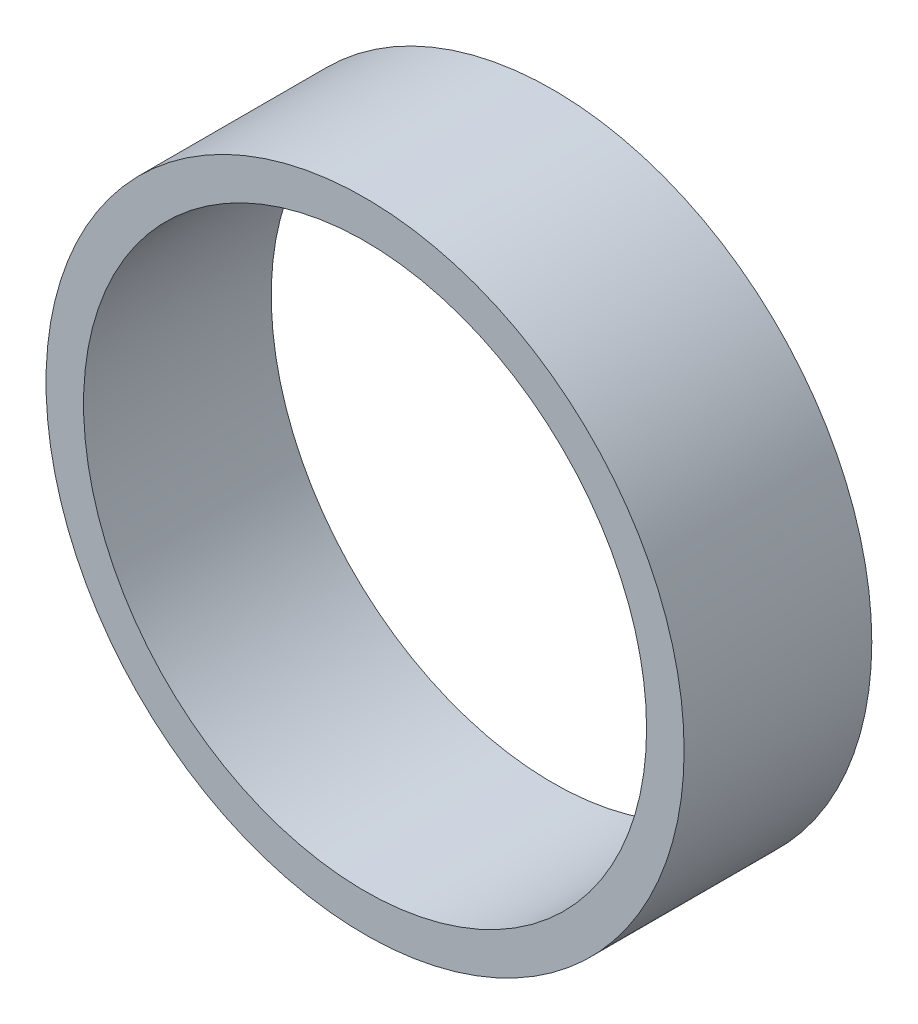
ISO-10303-21;
HEADER;
FILE_DESCRIPTION(('STEP AP214'),'2;1');
FILE_NAME('part.step','',(''),(''),'','','');
FILE_SCHEMA(('AUTOMOTIVE_DESIGN { 1 0 10303 214 1 1 1 1 }'));
ENDSEC;
DATA;
#1=APPLICATION_CONTEXT('core data for automotive mechanical design processes');
#2=APPLICATION_PROTOCOL_DEFINITION('international standard','automotive_design',2000,#1);
#3=PRODUCT_CONTEXT('',#1,'mechanical');
#4=PRODUCT('Part','Part','',(#3));
#5=PRODUCT_RELATED_PRODUCT_CATEGORY('part','',(#4));
#6=PRODUCT_DEFINITION_FORMATION('','',#4);
#7=PRODUCT_DEFINITION_CONTEXT('part definition',#1,'design');
#8=PRODUCT_DEFINITION('design','',#6,#7);
#9=PRODUCT_DEFINITION_SHAPE('','',#8);
#10=(LENGTH_UNIT() NAMED_UNIT(*) SI_UNIT(.MILLI.,.METRE.));
#11=(NAMED_UNIT(*) PLANE_ANGLE_UNIT() SI_UNIT($,.RADIAN.));
#12=(NAMED_UNIT(*) SI_UNIT($,.STERADIAN.) SOLID_ANGLE_UNIT());
#13=UNCERTAINTY_MEASURE_WITH_UNIT(LENGTH_MEASURE(1.E-05),#10,'distance_accuracy_value','');
#14=(GEOMETRIC_REPRESENTATION_CONTEXT(3) GLOBAL_UNCERTAINTY_ASSIGNED_CONTEXT((#13)) GLOBAL_UNIT_ASSIGNED_CONTEXT((#10,
#11,#12)) REPRESENTATION_CONTEXT('',''));
#15=CARTESIAN_POINT('',(0.,0.,0.));
#16=DIRECTION('',(0.,0.,1.));
#17=DIRECTION('',(1.,0.,0.));
#18=AXIS2_PLACEMENT_3D('',#15,#16,#17);
#19=CARTESIAN_POINT('',(0.,0.,2.));
#20=DIRECTION('',(0.,0.,1.));
#21=DIRECTION('',(1.,0.,0.));
#22=AXIS2_PLACEMENT_3D('',#19,#20,#21);
#23=PLANE('',#22);
#24=CARTESIAN_POINT('',(0.,0.,2.));
#25=DIRECTION('',(0.,0.,1.));
#26=DIRECTION('',(1.,0.,0.));
#27=AXIS2_PLACEMENT_3D('',#24,#25,#26);
#28=CIRCLE('',#27,6.8);
#29=CARTESIAN_POINT('',(6.8,0.,2.));
#30=VERTEX_POINT('',#29);
#31=EDGE_CURVE('E10',#30,#30,#28,.T.);
#32=ORIENTED_EDGE('',*,*,#31,.T.);
#33=EDGE_LOOP('',(#32));
#34=FACE_BOUND('',#33,.T.);
#35=CARTESIAN_POINT('',(0.,0.,2.));
#36=DIRECTION('',(0.,0.,1.));
#37=DIRECTION('',(1.,0.,0.));
#38=AXIS2_PLACEMENT_3D('',#35,#36,#37);
#39=CIRCLE('',#38,6.);
#40=CARTESIAN_POINT('',(6.,0.,2.));
#41=VERTEX_POINT('',#40);
#42=EDGE_CURVE('E48',#41,#41,#39,.T.);
#43=ORIENTED_EDGE('',*,*,#42,.F.);
#44=EDGE_LOOP('',(#43));
#45=FACE_BOUND('',#44,.T.);
#46=ADVANCED_FACE('F37',(#34,#45),#23,.T.);
#47=CARTESIAN_POINT('',(0.,0.,-2.));
#48=DIRECTION('',(0.,0.,1.));
#49=DIRECTION('',(1.,0.,0.));
#50=AXIS2_PLACEMENT_3D('',#47,#48,#49);
#51=PLANE('',#50);
#52=CARTESIAN_POINT('',(0.,0.,-2.));
#53=DIRECTION('',(0.,0.,1.));
#54=DIRECTION('',(1.,0.,0.));
#55=AXIS2_PLACEMENT_3D('',#52,#53,#54);
#56=CIRCLE('',#55,6.8);
#57=CARTESIAN_POINT('',(6.8,0.,-2.));
#58=VERTEX_POINT('',#57);
#59=EDGE_CURVE('E41',#58,#58,#56,.T.);
#60=ORIENTED_EDGE('',*,*,#59,.F.);
#61=EDGE_LOOP('',(#60));
#62=FACE_BOUND('',#61,.T.);
#63=CARTESIAN_POINT('',(0.,0.,-2.));
#64=DIRECTION('',(0.,0.,1.));
#65=DIRECTION('',(1.,0.,0.));
#66=AXIS2_PLACEMENT_3D('',#63,#64,#65);
#67=CIRCLE('',#66,6.);
#68=CARTESIAN_POINT('',(6.,0.,-2.));
#69=VERTEX_POINT('',#68);
#70=EDGE_CURVE('E50',#69,#69,#67,.T.);
#71=ORIENTED_EDGE('',*,*,#70,.T.);
#72=EDGE_LOOP('',(#71));
#73=FACE_BOUND('',#72,.T.);
#74=ADVANCED_FACE('F60',(#62,#73),#51,.F.);
#75=CARTESIAN_POINT('',(0.,0.,2.));
#76=DIRECTION('',(0.,0.,-1.));
#77=DIRECTION('',(-1.,0.,0.));
#78=AXIS2_PLACEMENT_3D('',#75,#76,#77);
#79=CYLINDRICAL_SURFACE('',#78,6.8);
#80=ORIENTED_EDGE('',*,*,#31,.F.);
#81=EDGE_LOOP('',(#80));
#82=FACE_BOUND('',#81,.T.);
#83=ORIENTED_EDGE('',*,*,#59,.T.);
#84=EDGE_LOOP('',(#83));
#85=FACE_BOUND('',#84,.T.);
#86=ADVANCED_FACE('F39',(#82,#85),#79,.T.);
#87=CARTESIAN_POINT('',(0.,0.,2.));
#88=DIRECTION('',(0.,0.,-1.));
#89=DIRECTION('',(-1.,0.,0.));
#90=AXIS2_PLACEMENT_3D('',#87,#88,#89);
#91=CYLINDRICAL_SURFACE('',#90,6.);
#92=ORIENTED_EDGE('',*,*,#42,.T.);
#93=EDGE_LOOP('',(#92));
#94=FACE_BOUND('',#93,.T.);
#95=ORIENTED_EDGE('',*,*,#70,.F.);
#96=EDGE_LOOP('',(#95));
#97=FACE_BOUND('',#96,.T.);
#98=ADVANCED_FACE('F56',(#94,#97),#91,.F.);
#99=CLOSED_SHELL('',(#46,#74,#86,#98));
#100=MANIFOLD_SOLID_BREP('B2',#99);
#101=ADVANCED_BREP_SHAPE_REPRESENTATION('',(#18,#100),#14);
#102=SHAPE_DEFINITION_REPRESENTATION(#9,#101);
ENDSEC;
END-ISO-10303-21;
